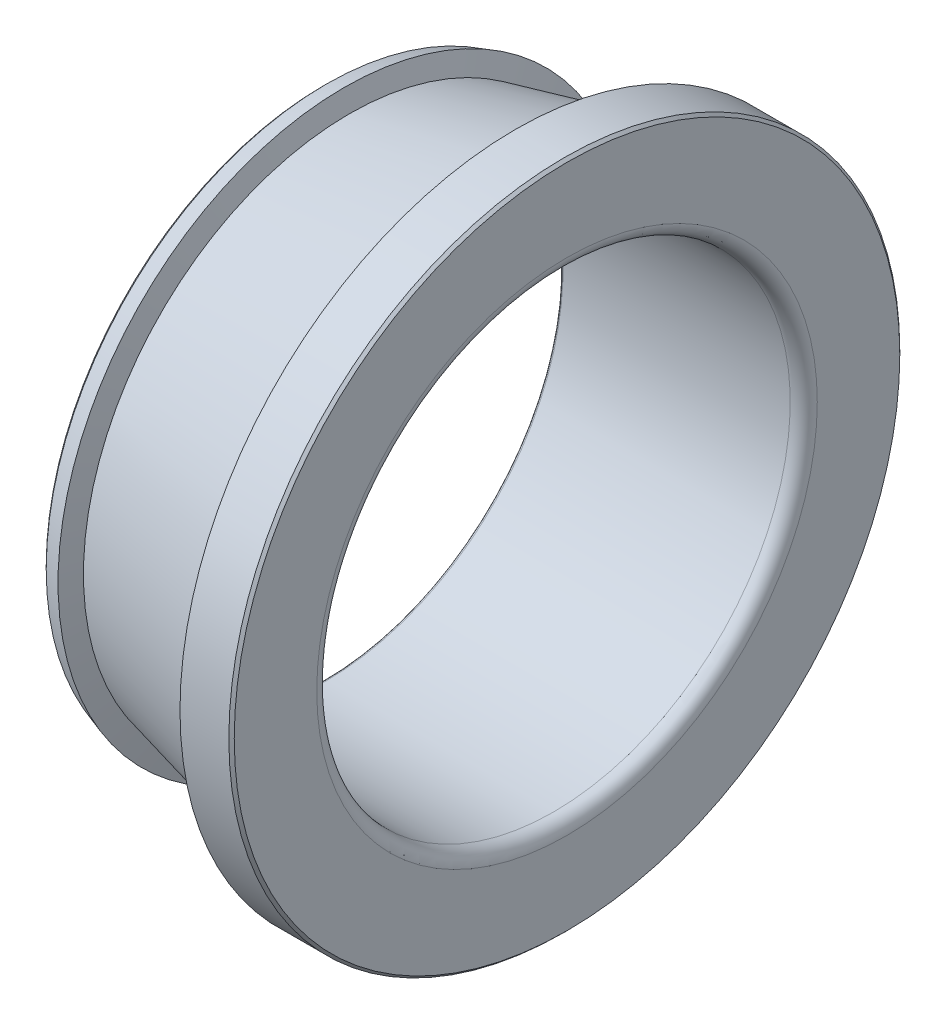
ISO-10303-21;
HEADER;
FILE_DESCRIPTION(('STEP AP214'),'2;1');
FILE_NAME('part.step','',(''),(''),'','','');
FILE_SCHEMA(('AUTOMOTIVE_DESIGN { 1 0 10303 214 1 1 1 1 }'));
ENDSEC;
DATA;
#1=APPLICATION_CONTEXT('core data for automotive mechanical design processes');
#2=APPLICATION_PROTOCOL_DEFINITION('international standard','automotive_design',2000,#1);
#3=PRODUCT_CONTEXT('',#1,'mechanical');
#4=PRODUCT('Part','Part','',(#3));
#5=PRODUCT_RELATED_PRODUCT_CATEGORY('part','',(#4));
#6=PRODUCT_DEFINITION_FORMATION('','',#4);
#7=PRODUCT_DEFINITION_CONTEXT('part definition',#1,'design');
#8=PRODUCT_DEFINITION('design','',#6,#7);
#9=PRODUCT_DEFINITION_SHAPE('','',#8);
#10=(LENGTH_UNIT() NAMED_UNIT(*) SI_UNIT(.MILLI.,.METRE.));
#11=(NAMED_UNIT(*) PLANE_ANGLE_UNIT() SI_UNIT($,.RADIAN.));
#12=(NAMED_UNIT(*) SI_UNIT($,.STERADIAN.) SOLID_ANGLE_UNIT());
#13=UNCERTAINTY_MEASURE_WITH_UNIT(LENGTH_MEASURE(1.E-05),#10,'distance_accuracy_value','');
#14=(GEOMETRIC_REPRESENTATION_CONTEXT(3) GLOBAL_UNCERTAINTY_ASSIGNED_CONTEXT((#13)) GLOBAL_UNIT_ASSIGNED_CONTEXT((#10,
#11,#12)) REPRESENTATION_CONTEXT('',''));
#15=CARTESIAN_POINT('',(0.,0.,0.));
#16=DIRECTION('',(0.,0.,1.));
#17=DIRECTION('',(1.,0.,0.));
#18=AXIS2_PLACEMENT_3D('',#15,#16,#17);
#19=CARTESIAN_POINT('',(6.4,0.,0.));
#20=DIRECTION('',(1.,0.,0.));
#21=DIRECTION('',(0.,1.,0.));
#22=AXIS2_PLACEMENT_3D('',#19,#20,#21);
#23=CONICAL_SURFACE('',#22,22.75,0.319329251622396);
#24=CARTESIAN_POINT('',(0.2,0.,0.));
#25=DIRECTION('',(1.,0.,0.));
#26=DIRECTION('',(0.,1.,0.));
#27=AXIS2_PLACEMENT_3D('',#24,#25,#26);
#28=CIRCLE('',#27,20.7);
#29=CARTESIAN_POINT('',(0.2,20.7,0.));
#30=VERTEX_POINT('',#29);
#31=EDGE_CURVE('E11',#30,#30,#28,.T.);
#32=ORIENTED_EDGE('',*,*,#31,.T.);
#33=EDGE_LOOP('',(#32));
#34=FACE_BOUND('',#33,.T.);
#35=CARTESIAN_POINT('',(1.50733579664605,0.,0.));
#36=DIRECTION('',(-1.,0.,0.));
#37=DIRECTION('',(0.,1.,0.));
#38=AXIS2_PLACEMENT_3D('',#35,#36,#37);
#39=CIRCLE('',#38,21.1322642553427);
#40=CARTESIAN_POINT('',(1.50733579664605,-21.1322642553427,0.));
#41=VERTEX_POINT('',#40);
#42=EDGE_CURVE('E68',#41,#41,#39,.T.);
#43=ORIENTED_EDGE('',*,*,#42,.T.);
#44=EDGE_LOOP('',(#43));
#45=FACE_BOUND('',#44,.T.);
#46=ADVANCED_FACE('F17',(#34,#45),#23,.T.);
#47=CARTESIAN_POINT('',(0.1,0.,0.));
#48=DIRECTION('',(1.,0.,0.));
#49=DIRECTION('',(0.,1.,0.));
#50=AXIS2_PLACEMENT_3D('',#47,#48,#49);
#51=CONICAL_SURFACE('',#50,20.6,0.785398163397446);
#52=CARTESIAN_POINT('',(0.,0.,0.));
#53=DIRECTION('',(1.,0.,0.));
#54=DIRECTION('',(0.,1.,0.));
#55=AXIS2_PLACEMENT_3D('',#52,#53,#54);
#56=CIRCLE('',#55,20.5);
#57=CARTESIAN_POINT('',(0.,20.5,0.));
#58=VERTEX_POINT('',#57);
#59=EDGE_CURVE('E27',#58,#58,#56,.T.);
#60=ORIENTED_EDGE('',*,*,#59,.T.);
#61=EDGE_LOOP('',(#60));
#62=FACE_BOUND('',#61,.T.);
#63=ORIENTED_EDGE('',*,*,#31,.F.);
#64=EDGE_LOOP('',(#63));
#65=FACE_BOUND('',#64,.T.);
#66=ADVANCED_FACE('F106',(#62,#65),#51,.T.);
#67=CARTESIAN_POINT('',(0.,19.1,0.));
#68=DIRECTION('',(-1.,0.,0.));
#69=DIRECTION('',(0.,-1.,0.));
#70=AXIS2_PLACEMENT_3D('',#67,#68,#69);
#71=PLANE('',#70);
#72=CARTESIAN_POINT('',(0.,0.,0.));
#73=DIRECTION('',(1.,0.,0.));
#74=DIRECTION('',(0.,1.,0.));
#75=AXIS2_PLACEMENT_3D('',#72,#73,#74);
#76=CIRCLE('',#75,17.7);
#77=CARTESIAN_POINT('',(0.,17.7,0.));
#78=VERTEX_POINT('',#77);
#79=EDGE_CURVE('E71',#78,#78,#76,.T.);
#80=ORIENTED_EDGE('',*,*,#79,.T.);
#81=EDGE_LOOP('',(#80));
#82=FACE_BOUND('',#81,.T.);
#83=ORIENTED_EDGE('',*,*,#59,.F.);
#84=EDGE_LOOP('',(#83));
#85=FACE_BOUND('',#84,.T.);
#86=ADVANCED_FACE('F111',(#82,#85),#71,.T.);
#87=CARTESIAN_POINT('',(0.2,0.,0.));
#88=DIRECTION('',(1.,0.,0.));
#89=DIRECTION('',(0.,0.,-1.));
#90=AXIS2_PLACEMENT_3D('',#87,#88,#89);
#91=TOROIDAL_SURFACE('',#90,17.7,0.2);
#92=CARTESIAN_POINT('',(0.2,0.,0.));
#93=DIRECTION('',(1.,0.,0.));
#94=DIRECTION('',(0.,1.,0.));
#95=AXIS2_PLACEMENT_3D('',#92,#93,#94);
#96=CIRCLE('',#95,17.5);
#97=CARTESIAN_POINT('',(0.2,17.5,0.));
#98=VERTEX_POINT('',#97);
#99=EDGE_CURVE('E73',#98,#98,#96,.T.);
#100=ORIENTED_EDGE('',*,*,#99,.T.);
#101=EDGE_LOOP('',(#100));
#102=FACE_BOUND('',#101,.T.);
#103=ORIENTED_EDGE('',*,*,#79,.F.);
#104=EDGE_LOOP('',(#103));
#105=FACE_BOUND('',#104,.T.);
#106=ADVANCED_FACE('F101',(#102,#105),#91,.T.);
#107=CARTESIAN_POINT('',(8.6,0.,0.));
#108=DIRECTION('',(-1.,0.,0.));
#109=DIRECTION('',(0.,1.,0.));
#110=AXIS2_PLACEMENT_3D('',#107,#108,#109);
#111=CYLINDRICAL_SURFACE('',#110,17.5);
#112=CARTESIAN_POINT('',(17.,0.,0.));
#113=DIRECTION('',(1.,0.,0.));
#114=DIRECTION('',(0.,1.,0.));
#115=AXIS2_PLACEMENT_3D('',#112,#113,#114);
#116=CIRCLE('',#115,17.5);
#117=CARTESIAN_POINT('',(17.,17.5,0.));
#118=VERTEX_POINT('',#117);
#119=EDGE_CURVE('E75',#118,#118,#116,.T.);
#120=ORIENTED_EDGE('',*,*,#119,.T.);
#121=EDGE_LOOP('',(#120));
#122=FACE_BOUND('',#121,.T.);
#123=ORIENTED_EDGE('',*,*,#99,.F.);
#124=EDGE_LOOP('',(#123));
#125=FACE_BOUND('',#124,.T.);
#126=ADVANCED_FACE('F89',(#122,#125),#111,.F.);
#127=CARTESIAN_POINT('',(17.,0.,0.));
#128=DIRECTION('',(1.,0.,0.));
#129=DIRECTION('',(0.,0.,-1.));
#130=AXIS2_PLACEMENT_3D('',#127,#128,#129);
#131=TOROIDAL_SURFACE('',#130,18.5,1.);
#132=CARTESIAN_POINT('',(18.,0.,0.));
#133=DIRECTION('',(1.,0.,0.));
#134=DIRECTION('',(0.,1.,0.));
#135=AXIS2_PLACEMENT_3D('',#132,#133,#134);
#136=CIRCLE('',#135,18.5);
#137=CARTESIAN_POINT('',(18.,18.5,0.));
#138=VERTEX_POINT('',#137);
#139=EDGE_CURVE('E21',#138,#138,#136,.T.);
#140=ORIENTED_EDGE('',*,*,#139,.T.);
#141=EDGE_LOOP('',(#140));
#142=FACE_BOUND('',#141,.T.);
#143=ORIENTED_EDGE('',*,*,#119,.F.);
#144=EDGE_LOOP('',(#143));
#145=FACE_BOUND('',#144,.T.);
#146=ADVANCED_FACE('F92',(#142,#145),#131,.T.);
#147=CARTESIAN_POINT('',(18.,21.55,0.));
#148=DIRECTION('',(1.,0.,0.));
#149=DIRECTION('',(0.,1.,0.));
#150=AXIS2_PLACEMENT_3D('',#147,#148,#149);
#151=PLANE('',#150);
#152=CARTESIAN_POINT('',(18.,0.,0.));
#153=DIRECTION('',(1.,0.,0.));
#154=DIRECTION('',(0.,1.,0.));
#155=AXIS2_PLACEMENT_3D('',#152,#153,#154);
#156=CIRCLE('',#155,24.6);
#157=CARTESIAN_POINT('',(18.,24.6,0.));
#158=VERTEX_POINT('',#157);
#159=EDGE_CURVE('E79',#158,#158,#156,.T.);
#160=ORIENTED_EDGE('',*,*,#159,.T.);
#161=EDGE_LOOP('',(#160));
#162=FACE_BOUND('',#161,.T.);
#163=ORIENTED_EDGE('',*,*,#139,.F.);
#164=EDGE_LOOP('',(#163));
#165=FACE_BOUND('',#164,.T.);
#166=ADVANCED_FACE('F94',(#162,#165),#151,.T.);
#167=CARTESIAN_POINT('',(17.9,0.,0.));
#168=DIRECTION('',(-1.,0.,0.));
#169=DIRECTION('',(0.,1.,0.));
#170=AXIS2_PLACEMENT_3D('',#167,#168,#169);
#171=CONICAL_SURFACE('',#170,24.7,0.785398163397448);
#172=CARTESIAN_POINT('',(17.8,0.,0.));
#173=DIRECTION('',(1.,0.,0.));
#174=DIRECTION('',(0.,1.,0.));
#175=AXIS2_PLACEMENT_3D('',#172,#173,#174);
#176=CIRCLE('',#175,24.8);
#177=CARTESIAN_POINT('',(17.8,24.8,0.));
#178=VERTEX_POINT('',#177);
#179=EDGE_CURVE('E78',#178,#178,#176,.T.);
#180=ORIENTED_EDGE('',*,*,#179,.T.);
#181=EDGE_LOOP('',(#180));
#182=FACE_BOUND('',#181,.T.);
#183=ORIENTED_EDGE('',*,*,#159,.F.);
#184=EDGE_LOOP('',(#183));
#185=FACE_BOUND('',#184,.T.);
#186=ADVANCED_FACE('F19',(#182,#185),#171,.T.);
#187=CARTESIAN_POINT('',(15.2,0.,0.));
#188=DIRECTION('',(-1.,0.,0.));
#189=DIRECTION('',(0.,1.,0.));
#190=AXIS2_PLACEMENT_3D('',#187,#188,#189);
#191=CYLINDRICAL_SURFACE('',#190,24.8);
#192=ORIENTED_EDGE('',*,*,#179,.F.);
#193=EDGE_LOOP('',(#192));
#194=FACE_BOUND('',#193,.T.);
#195=CARTESIAN_POINT('',(14.1895569346604,0.,0.));
#196=DIRECTION('',(1.,0.,0.));
#197=DIRECTION('',(0.,1.,0.));
#198=AXIS2_PLACEMENT_3D('',#195,#196,#197);
#199=CIRCLE('',#198,24.8);
#200=CARTESIAN_POINT('',(14.1895569346604,-24.8,0.));
#201=VERTEX_POINT('',#200);
#202=EDGE_CURVE('E77',#201,#201,#199,.T.);
#203=ORIENTED_EDGE('',*,*,#202,.T.);
#204=EDGE_LOOP('',(#203));
#205=FACE_BOUND('',#204,.T.);
#206=ADVANCED_FACE('F120',(#194,#205),#191,.T.);
#207=CARTESIAN_POINT('',(13.8679430067861,0.,0.));
#208=DIRECTION('',(-1.,0.,0.));
#209=DIRECTION('',(0.,1.,0.));
#210=AXIS2_PLACEMENT_3D('',#207,#208,#209);
#211=CONICAL_SURFACE('',#210,25.987856468331,1.30638418110551);
#212=CARTESIAN_POINT('',(14.7499718826372,0.,0.));
#213=DIRECTION('',(1.,0.,0.));
#214=DIRECTION('',(0.,1.,0.));
#215=AXIS2_PLACEMENT_3D('',#212,#213,#214);
#216=CIRCLE('',#215,22.7301502105226);
#217=CARTESIAN_POINT('',(14.7499718826372,22.7301502105226,0.));
#218=VERTEX_POINT('',#217);
#219=EDGE_CURVE('E66',#218,#218,#216,.T.);
#220=ORIENTED_EDGE('',*,*,#219,.T.);
#221=EDGE_LOOP('',(#220));
#222=FACE_BOUND('',#221,.T.);
#223=ORIENTED_EDGE('',*,*,#202,.F.);
#224=EDGE_LOOP('',(#223));
#225=FACE_BOUND('',#224,.T.);
#226=ADVANCED_FACE('F116',(#222,#225),#211,.F.);
#227=CARTESIAN_POINT('',(1.12669186513497,0.,0.));
#228=DIRECTION('',(-1.,0.,0.));
#229=DIRECTION('',(0.,1.,0.));
#230=AXIS2_PLACEMENT_3D('',#227,#228,#229);
#231=CONICAL_SURFACE('',#230,22.5381435316689,1.30638418110551);
#232=CARTESIAN_POINT('',(1.90734201601857,0.,0.));
#233=DIRECTION('',(1.,0.,0.));
#234=DIRECTION('',(0.,1.,0.));
#235=AXIS2_PLACEMENT_3D('',#232,#233,#234);
#236=CIRCLE('',#235,19.6548718482576);
#237=CARTESIAN_POINT('',(1.90734201601857,19.6548718482576,0.));
#238=VERTEX_POINT('',#237);
#239=EDGE_CURVE('E63',#238,#238,#236,.T.);
#240=ORIENTED_EDGE('',*,*,#239,.F.);
#241=EDGE_LOOP('',(#240));
#242=FACE_BOUND('',#241,.T.);
#243=ORIENTED_EDGE('',*,*,#42,.F.);
#244=EDGE_LOOP('',(#243));
#245=FACE_BOUND('',#244,.T.);
#246=ADVANCED_FACE('F119',(#242,#245),#231,.T.);
#247=CARTESIAN_POINT('',(8.32865694932788,0.,0.));
#248=DIRECTION('',(1.,0.,0.));
#249=DIRECTION('',(0.,1.,0.));
#250=AXIS2_PLACEMENT_3D('',#247,#248,#249);
#251=CONICAL_SURFACE('',#250,21.1925110293901,0.235033018390565);
#252=ORIENTED_EDGE('',*,*,#219,.F.);
#253=EDGE_LOOP('',(#252));
#254=FACE_BOUND('',#253,.T.);
#255=ORIENTED_EDGE('',*,*,#239,.T.);
#256=EDGE_LOOP('',(#255));
#257=FACE_BOUND('',#256,.T.);
#258=ADVANCED_FACE('F64',(#254,#257),#251,.T.);
#259=CLOSED_SHELL('',(#46,#66,#86,#106,#126,#146,#166,#186,#206,#226,#246,#258));
#260=MANIFOLD_SOLID_BREP('B1',#259);
#261=ADVANCED_BREP_SHAPE_REPRESENTATION('',(#18,#260),#14);
#262=SHAPE_DEFINITION_REPRESENTATION(#9,#261);
ENDSEC;
END-ISO-10303-21;
